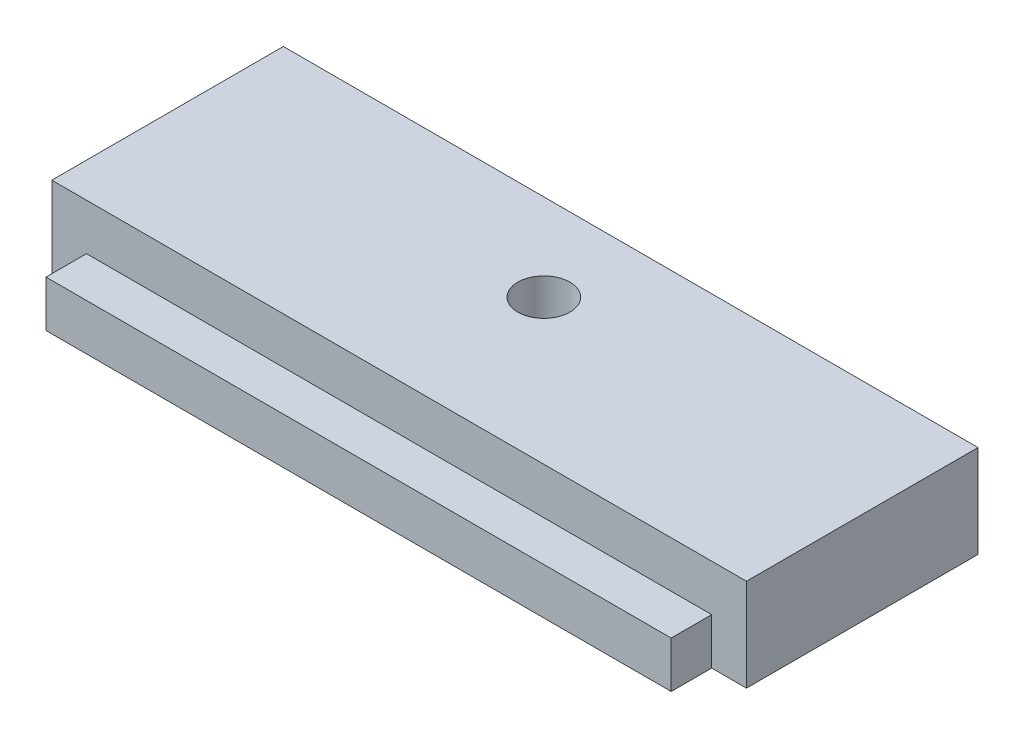
ISO-10303-21;
HEADER;
FILE_DESCRIPTION(('STEP AP214'),'2;1');
FILE_NAME('part.step','',(''),(''),'','','');
FILE_SCHEMA(('AUTOMOTIVE_DESIGN { 1 0 10303 214 1 1 1 1 }'));
ENDSEC;
DATA;
#1=APPLICATION_CONTEXT('core data for automotive mechanical design processes');
#2=APPLICATION_PROTOCOL_DEFINITION('international standard','automotive_design',2000,#1);
#3=PRODUCT_CONTEXT('',#1,'mechanical');
#4=PRODUCT('Part','Part','',(#3));
#5=PRODUCT_RELATED_PRODUCT_CATEGORY('part','',(#4));
#6=PRODUCT_DEFINITION_FORMATION('','',#4);
#7=PRODUCT_DEFINITION_CONTEXT('part definition',#1,'design');
#8=PRODUCT_DEFINITION('design','',#6,#7);
#9=PRODUCT_DEFINITION_SHAPE('','',#8);
#10=(LENGTH_UNIT() NAMED_UNIT(*) SI_UNIT(.MILLI.,.METRE.));
#11=(NAMED_UNIT(*) PLANE_ANGLE_UNIT() SI_UNIT($,.RADIAN.));
#12=(NAMED_UNIT(*) SI_UNIT($,.STERADIAN.) SOLID_ANGLE_UNIT());
#13=UNCERTAINTY_MEASURE_WITH_UNIT(LENGTH_MEASURE(1.E-05),#10,'distance_accuracy_value','');
#14=(GEOMETRIC_REPRESENTATION_CONTEXT(3) GLOBAL_UNCERTAINTY_ASSIGNED_CONTEXT((#13)) GLOBAL_UNIT_ASSIGNED_CONTEXT((#10,
#11,#12)) REPRESENTATION_CONTEXT('',''));
#15=CARTESIAN_POINT('',(0.,0.,0.));
#16=DIRECTION('',(0.,0.,1.));
#17=DIRECTION('',(1.,0.,0.));
#18=AXIS2_PLACEMENT_3D('',#15,#16,#17);
#19=CARTESIAN_POINT('',(3.,0.,3.5));
#20=DIRECTION('',(-1.,0.,0.));
#21=DIRECTION('',(0.,0.,1.));
#22=AXIS2_PLACEMENT_3D('',#19,#20,#21);
#23=PLANE('',#22);
#24=DIRECTION('',(0.,1.,0.));
#25=VECTOR('',#24,1.);
#26=CARTESIAN_POINT('',(3.,0.,0.));
#27=LINE('',#26,#25);
#28=CARTESIAN_POINT('',(3.,0.,0.));
#29=VERTEX_POINT('',#28);
#30=CARTESIAN_POINT('',(3.,4.,0.));
#31=VERTEX_POINT('',#30);
#32=EDGE_CURVE('E155',#29,#31,#27,.T.);
#33=ORIENTED_EDGE('',*,*,#32,.F.);
#34=DIRECTION('',(0.,0.,-1.));
#35=VECTOR('',#34,1.);
#36=CARTESIAN_POINT('',(3.,0.,3.5));
#37=LINE('',#36,#35);
#38=CARTESIAN_POINT('',(3.,0.,3.5));
#39=VERTEX_POINT('',#38);
#40=EDGE_CURVE('E11',#39,#29,#37,.T.);
#41=ORIENTED_EDGE('',*,*,#40,.F.);
#42=DIRECTION('',(0.,1.,0.));
#43=VECTOR('',#42,1.);
#44=CARTESIAN_POINT('',(3.,0.,3.5));
#45=LINE('',#44,#43);
#46=CARTESIAN_POINT('',(3.,4.,3.5));
#47=VERTEX_POINT('',#46);
#48=EDGE_CURVE('E156',#39,#47,#45,.T.);
#49=ORIENTED_EDGE('',*,*,#48,.T.);
#50=DIRECTION('',(0.,0.,-1.));
#51=VECTOR('',#50,1.);
#52=CARTESIAN_POINT('',(3.,4.,3.5));
#53=LINE('',#52,#51);
#54=EDGE_CURVE('E44',#47,#31,#53,.T.);
#55=ORIENTED_EDGE('',*,*,#54,.T.);
#56=EDGE_LOOP('',(#33,#41,#49,#55));
#57=FACE_BOUND('',#56,.T.);
#58=ADVANCED_FACE('F41',(#57),#23,.T.);
#59=CARTESIAN_POINT('',(3.,0.,3.5));
#60=DIRECTION('',(0.,1.,0.));
#61=DIRECTION('',(0.,0.,1.));
#62=AXIS2_PLACEMENT_3D('',#59,#60,#61);
#63=PLANE('',#62);
#64=CARTESIAN_POINT('',(30.,0.,-12.5));
#65=DIRECTION('',(0.,1.,0.));
#66=DIRECTION('',(0.,0.,1.));
#67=AXIS2_PLACEMENT_3D('',#64,#65,#66);
#68=CIRCLE('',#67,2.25);
#69=CARTESIAN_POINT('',(30.,0.,-10.25));
#70=VERTEX_POINT('',#69);
#71=EDGE_CURVE('E133',#70,#70,#68,.T.);
#72=ORIENTED_EDGE('',*,*,#71,.T.);
#73=EDGE_LOOP('',(#72));
#74=FACE_BOUND('',#73,.T.);
#75=ORIENTED_EDGE('',*,*,#40,.T.);
#76=DIRECTION('',(-1.,0.,0.));
#77=VECTOR('',#76,1.);
#78=CARTESIAN_POINT('',(0.,0.,0.));
#79=LINE('',#78,#77);
#80=CARTESIAN_POINT('',(0.,0.,0.));
#81=VERTEX_POINT('',#80);
#82=EDGE_CURVE('E142',#29,#81,#79,.T.);
#83=ORIENTED_EDGE('',*,*,#82,.T.);
#84=DIRECTION('',(0.,0.,1.));
#85=VECTOR('',#84,1.);
#86=CARTESIAN_POINT('',(0.,0.,-10.));
#87=LINE('',#86,#85);
#88=CARTESIAN_POINT('',(0.,0.,-20.));
#89=VERTEX_POINT('',#88);
#90=EDGE_CURVE('E117',#89,#81,#87,.T.);
#91=ORIENTED_EDGE('',*,*,#90,.F.);
#92=DIRECTION('',(-1.,0.,0.));
#93=VECTOR('',#92,1.);
#94=CARTESIAN_POINT('',(60.,0.,-20.));
#95=LINE('',#94,#93);
#96=CARTESIAN_POINT('',(60.,0.,-20.));
#97=VERTEX_POINT('',#96);
#98=EDGE_CURVE('E121',#97,#89,#95,.T.);
#99=ORIENTED_EDGE('',*,*,#98,.F.);
#100=DIRECTION('',(0.,0.,1.));
#101=VECTOR('',#100,1.);
#102=CARTESIAN_POINT('',(60.,0.,-10.));
#103=LINE('',#102,#101);
#104=CARTESIAN_POINT('',(60.,0.,0.));
#105=VERTEX_POINT('',#104);
#106=EDGE_CURVE('E107',#97,#105,#103,.T.);
#107=ORIENTED_EDGE('',*,*,#106,.T.);
#108=CARTESIAN_POINT('',(57.,0.,0.));
#109=VERTEX_POINT('',#108);
#110=EDGE_CURVE('E118',#105,#109,#79,.T.);
#111=ORIENTED_EDGE('',*,*,#110,.T.);
#112=DIRECTION('',(0.,0.,-1.));
#113=VECTOR('',#112,1.);
#114=CARTESIAN_POINT('',(57.,0.,3.5));
#115=LINE('',#114,#113);
#116=CARTESIAN_POINT('',(57.,0.,3.5));
#117=VERTEX_POINT('',#116);
#118=EDGE_CURVE('E49',#117,#109,#115,.T.);
#119=ORIENTED_EDGE('',*,*,#118,.F.);
#120=DIRECTION('',(1.,0.,0.));
#121=VECTOR('',#120,1.);
#122=CARTESIAN_POINT('',(3.,0.,3.5));
#123=LINE('',#122,#121);
#124=EDGE_CURVE('E62',#39,#117,#123,.T.);
#125=ORIENTED_EDGE('',*,*,#124,.F.);
#126=EDGE_LOOP('',(#75,#83,#91,#99,#107,#111,#119,#125));
#127=FACE_BOUND('',#126,.T.);
#128=ADVANCED_FACE('F122',(#74,#127),#63,.F.);
#129=CARTESIAN_POINT('',(57.,0.,3.5));
#130=DIRECTION('',(-1.,0.,0.));
#131=DIRECTION('',(0.,0.,1.));
#132=AXIS2_PLACEMENT_3D('',#129,#130,#131);
#133=PLANE('',#132);
#134=DIRECTION('',(0.,1.,0.));
#135=VECTOR('',#134,1.);
#136=CARTESIAN_POINT('',(57.,0.,0.));
#137=LINE('',#136,#135);
#138=CARTESIAN_POINT('',(57.,4.,0.));
#139=VERTEX_POINT('',#138);
#140=EDGE_CURVE('E159',#109,#139,#137,.T.);
#141=ORIENTED_EDGE('',*,*,#140,.T.);
#142=DIRECTION('',(0.,0.,-1.));
#143=VECTOR('',#142,1.);
#144=CARTESIAN_POINT('',(57.,4.,3.5));
#145=LINE('',#144,#143);
#146=CARTESIAN_POINT('',(57.,4.,3.5));
#147=VERTEX_POINT('',#146);
#148=EDGE_CURVE('E171',#147,#139,#145,.T.);
#149=ORIENTED_EDGE('',*,*,#148,.F.);
#150=DIRECTION('',(0.,1.,0.));
#151=VECTOR('',#150,1.);
#152=CARTESIAN_POINT('',(57.,0.,3.5));
#153=LINE('',#152,#151);
#154=EDGE_CURVE('E162',#117,#147,#153,.T.);
#155=ORIENTED_EDGE('',*,*,#154,.F.);
#156=ORIENTED_EDGE('',*,*,#118,.T.);
#157=EDGE_LOOP('',(#141,#149,#155,#156));
#158=FACE_BOUND('',#157,.T.);
#159=ADVANCED_FACE('F187',(#158),#133,.F.);
#160=CARTESIAN_POINT('',(3.,4.,3.5));
#161=DIRECTION('',(0.,1.,0.));
#162=DIRECTION('',(0.,0.,1.));
#163=AXIS2_PLACEMENT_3D('',#160,#161,#162);
#164=PLANE('',#163);
#165=DIRECTION('',(1.,0.,0.));
#166=VECTOR('',#165,1.);
#167=CARTESIAN_POINT('',(3.,4.,0.));
#168=LINE('',#167,#166);
#169=EDGE_CURVE('E166',#31,#139,#168,.T.);
#170=ORIENTED_EDGE('',*,*,#169,.F.);
#171=ORIENTED_EDGE('',*,*,#54,.F.);
#172=DIRECTION('',(1.,0.,0.));
#173=VECTOR('',#172,1.);
#174=CARTESIAN_POINT('',(3.,4.,3.5));
#175=LINE('',#174,#173);
#176=EDGE_CURVE('E158',#47,#147,#175,.T.);
#177=ORIENTED_EDGE('',*,*,#176,.T.);
#178=ORIENTED_EDGE('',*,*,#148,.T.);
#179=EDGE_LOOP('',(#170,#171,#177,#178));
#180=FACE_BOUND('',#179,.T.);
#181=ADVANCED_FACE('F178',(#180),#164,.T.);
#182=CARTESIAN_POINT('',(0.,0.,3.5));
#183=DIRECTION('',(0.,0.,-1.));
#184=DIRECTION('',(-1.,0.,0.));
#185=AXIS2_PLACEMENT_3D('',#182,#183,#184);
#186=PLANE('',#185);
#187=ORIENTED_EDGE('',*,*,#48,.F.);
#188=ORIENTED_EDGE('',*,*,#124,.T.);
#189=ORIENTED_EDGE('',*,*,#154,.T.);
#190=ORIENTED_EDGE('',*,*,#176,.F.);
#191=EDGE_LOOP('',(#187,#188,#189,#190));
#192=FACE_BOUND('',#191,.T.);
#193=ADVANCED_FACE('F185',(#192),#186,.F.);
#194=CARTESIAN_POINT('',(0.,0.,0.));
#195=DIRECTION('',(0.,0.,-1.));
#196=DIRECTION('',(-1.,0.,0.));
#197=AXIS2_PLACEMENT_3D('',#194,#195,#196);
#198=PLANE('',#197);
#199=DIRECTION('',(0.,1.,0.));
#200=VECTOR('',#199,1.);
#201=CARTESIAN_POINT('',(0.,8.,0.));
#202=LINE('',#201,#200);
#203=CARTESIAN_POINT('',(0.,8.,0.));
#204=VERTEX_POINT('',#203);
#205=EDGE_CURVE('E146',#81,#204,#202,.T.);
#206=ORIENTED_EDGE('',*,*,#205,.F.);
#207=ORIENTED_EDGE('',*,*,#82,.F.);
#208=ORIENTED_EDGE('',*,*,#32,.T.);
#209=ORIENTED_EDGE('',*,*,#169,.T.);
#210=ORIENTED_EDGE('',*,*,#140,.F.);
#211=ORIENTED_EDGE('',*,*,#110,.F.);
#212=DIRECTION('',(0.,-1.,0.));
#213=VECTOR('',#212,1.);
#214=CARTESIAN_POINT('',(60.,8.,0.));
#215=LINE('',#214,#213);
#216=CARTESIAN_POINT('',(60.,8.,0.));
#217=VERTEX_POINT('',#216);
#218=EDGE_CURVE('E114',#217,#105,#215,.T.);
#219=ORIENTED_EDGE('',*,*,#218,.F.);
#220=DIRECTION('',(1.,0.,0.));
#221=VECTOR('',#220,1.);
#222=CARTESIAN_POINT('',(60.,8.,0.));
#223=LINE('',#222,#221);
#224=EDGE_CURVE('E148',#204,#217,#223,.T.);
#225=ORIENTED_EDGE('',*,*,#224,.F.);
#226=EDGE_LOOP('',(#206,#207,#208,#209,#210,#211,#219,#225));
#227=FACE_BOUND('',#226,.T.);
#228=ADVANCED_FACE('F182',(#227),#198,.F.);
#229=CARTESIAN_POINT('',(60.,8.,-5.));
#230=DIRECTION('',(-1.,0.,0.));
#231=DIRECTION('',(0.,0.,1.));
#232=AXIS2_PLACEMENT_3D('',#229,#230,#231);
#233=PLANE('',#232);
#234=ORIENTED_EDGE('',*,*,#218,.T.);
#235=ORIENTED_EDGE('',*,*,#106,.F.);
#236=DIRECTION('',(0.,-1.,0.));
#237=VECTOR('',#236,1.);
#238=CARTESIAN_POINT('',(60.,8.,-20.));
#239=LINE('',#238,#237);
#240=CARTESIAN_POINT('',(60.,8.,-20.));
#241=VERTEX_POINT('',#240);
#242=EDGE_CURVE('E112',#241,#97,#239,.T.);
#243=ORIENTED_EDGE('',*,*,#242,.F.);
#244=DIRECTION('',(0.,0.,1.));
#245=VECTOR('',#244,1.);
#246=CARTESIAN_POINT('',(60.,8.,-5.));
#247=LINE('',#246,#245);
#248=EDGE_CURVE('E150',#241,#217,#247,.T.);
#249=ORIENTED_EDGE('',*,*,#248,.T.);
#250=EDGE_LOOP('',(#234,#235,#243,#249));
#251=FACE_BOUND('',#250,.T.);
#252=ADVANCED_FACE('F109',(#251),#233,.F.);
#253=CARTESIAN_POINT('',(0.,8.,-5.));
#254=DIRECTION('',(1.,0.,0.));
#255=DIRECTION('',(0.,1.,0.));
#256=AXIS2_PLACEMENT_3D('',#253,#254,#255);
#257=PLANE('',#256);
#258=DIRECTION('',(0.,0.,1.));
#259=VECTOR('',#258,1.);
#260=CARTESIAN_POINT('',(0.,8.,-5.));
#261=LINE('',#260,#259);
#262=CARTESIAN_POINT('',(0.,8.,-20.));
#263=VERTEX_POINT('',#262);
#264=EDGE_CURVE('E152',#263,#204,#261,.T.);
#265=ORIENTED_EDGE('',*,*,#264,.F.);
#266=DIRECTION('',(0.,1.,0.));
#267=VECTOR('',#266,1.);
#268=CARTESIAN_POINT('',(0.,0.,-20.));
#269=LINE('',#268,#267);
#270=EDGE_CURVE('E127',#89,#263,#269,.T.);
#271=ORIENTED_EDGE('',*,*,#270,.F.);
#272=ORIENTED_EDGE('',*,*,#90,.T.);
#273=ORIENTED_EDGE('',*,*,#205,.T.);
#274=EDGE_LOOP('',(#265,#271,#272,#273));
#275=FACE_BOUND('',#274,.T.);
#276=ADVANCED_FACE('F228',(#275),#257,.F.);
#277=CARTESIAN_POINT('',(60.,8.,-5.));
#278=DIRECTION('',(0.,-1.,0.));
#279=DIRECTION('',(0.,0.,-1.));
#280=AXIS2_PLACEMENT_3D('',#277,#278,#279);
#281=PLANE('',#280);
#282=CARTESIAN_POINT('',(30.,8.,-12.5));
#283=DIRECTION('',(0.,1.,0.));
#284=DIRECTION('',(0.,0.,1.));
#285=AXIS2_PLACEMENT_3D('',#282,#283,#284);
#286=CIRCLE('',#285,2.25);
#287=CARTESIAN_POINT('',(30.,8.,-10.25));
#288=VERTEX_POINT('',#287);
#289=EDGE_CURVE('E136',#288,#288,#286,.T.);
#290=ORIENTED_EDGE('',*,*,#289,.F.);
#291=EDGE_LOOP('',(#290));
#292=FACE_BOUND('',#291,.T.);
#293=ORIENTED_EDGE('',*,*,#224,.T.);
#294=ORIENTED_EDGE('',*,*,#248,.F.);
#295=DIRECTION('',(1.,0.,0.));
#296=VECTOR('',#295,1.);
#297=CARTESIAN_POINT('',(0.,8.,-20.));
#298=LINE('',#297,#296);
#299=EDGE_CURVE('E132',#263,#241,#298,.T.);
#300=ORIENTED_EDGE('',*,*,#299,.F.);
#301=ORIENTED_EDGE('',*,*,#264,.T.);
#302=EDGE_LOOP('',(#293,#294,#300,#301));
#303=FACE_BOUND('',#302,.T.);
#304=ADVANCED_FACE('F239',(#292,#303),#281,.F.);
#305=CARTESIAN_POINT('',(0.,0.,-20.));
#306=DIRECTION('',(0.,0.,-1.));
#307=DIRECTION('',(-1.,0.,0.));
#308=AXIS2_PLACEMENT_3D('',#305,#306,#307);
#309=PLANE('',#308);
#310=ORIENTED_EDGE('',*,*,#242,.T.);
#311=ORIENTED_EDGE('',*,*,#98,.T.);
#312=ORIENTED_EDGE('',*,*,#270,.T.);
#313=ORIENTED_EDGE('',*,*,#299,.T.);
#314=EDGE_LOOP('',(#310,#311,#312,#313));
#315=FACE_BOUND('',#314,.T.);
#316=ADVANCED_FACE('F130',(#315),#309,.T.);
#317=CARTESIAN_POINT('',(30.,0.,-12.5));
#318=DIRECTION('',(0.,1.,0.));
#319=DIRECTION('',(0.,0.,1.));
#320=AXIS2_PLACEMENT_3D('',#317,#318,#319);
#321=CYLINDRICAL_SURFACE('',#320,2.25);
#322=ORIENTED_EDGE('',*,*,#71,.F.);
#323=EDGE_LOOP('',(#322));
#324=FACE_BOUND('',#323,.T.);
#325=ORIENTED_EDGE('',*,*,#289,.T.);
#326=EDGE_LOOP('',(#325));
#327=FACE_BOUND('',#326,.T.);
#328=ADVANCED_FACE('F252',(#324,#327),#321,.F.);
#329=CLOSED_SHELL('',(#58,#128,#159,#181,#193,#228,#252,#276,#304,#316,#328));
#330=MANIFOLD_SOLID_BREP('B2',#329);
#331=ADVANCED_BREP_SHAPE_REPRESENTATION('',(#18,#330),#14);
#332=SHAPE_DEFINITION_REPRESENTATION(#9,#331);
ENDSEC;
END-ISO-10303-21;
